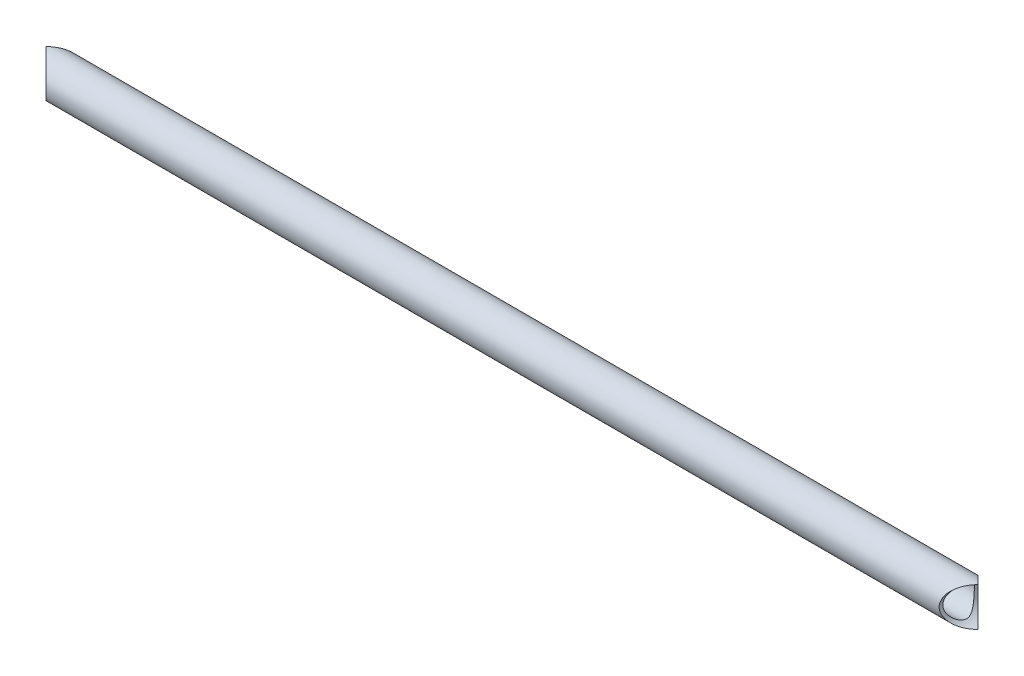
ISO-10303-21;
HEADER;
FILE_DESCRIPTION(('STEP AP214'),'2;1');
FILE_NAME('part.step','',(''),(''),'','','');
FILE_SCHEMA(('AUTOMOTIVE_DESIGN { 1 0 10303 214 1 1 1 1 }'));
ENDSEC;
DATA;
#1=APPLICATION_CONTEXT('core data for automotive mechanical design processes');
#2=APPLICATION_PROTOCOL_DEFINITION('international standard','automotive_design',2000,#1);
#3=PRODUCT_CONTEXT('',#1,'mechanical');
#4=PRODUCT('Part','Part','',(#3));
#5=PRODUCT_RELATED_PRODUCT_CATEGORY('part','',(#4));
#6=PRODUCT_DEFINITION_FORMATION('','',#4);
#7=PRODUCT_DEFINITION_CONTEXT('part definition',#1,'design');
#8=PRODUCT_DEFINITION('design','',#6,#7);
#9=PRODUCT_DEFINITION_SHAPE('','',#8);
#10=(LENGTH_UNIT() NAMED_UNIT(*) SI_UNIT(.MILLI.,.METRE.));
#11=(NAMED_UNIT(*) PLANE_ANGLE_UNIT() SI_UNIT($,.RADIAN.));
#12=(NAMED_UNIT(*) SI_UNIT($,.STERADIAN.) SOLID_ANGLE_UNIT());
#13=UNCERTAINTY_MEASURE_WITH_UNIT(LENGTH_MEASURE(1.E-05),#10,'distance_accuracy_value','');
#14=(GEOMETRIC_REPRESENTATION_CONTEXT(3) GLOBAL_UNCERTAINTY_ASSIGNED_CONTEXT((#13)) GLOBAL_UNIT_ASSIGNED_CONTEXT((#10,
#11,#12)) REPRESENTATION_CONTEXT('',''));
#15=CARTESIAN_POINT('',(0.,0.,0.));
#16=DIRECTION('',(0.,0.,1.));
#17=DIRECTION('',(1.,0.,0.));
#18=AXIS2_PLACEMENT_3D('',#15,#16,#17);
#19=CARTESIAN_POINT('',(473.575059000242,250.,-150.));
#20=DIRECTION('',(1.,0.,0.));
#21=DIRECTION('',(0.,0.,-1.));
#22=AXIS2_PLACEMENT_3D('',#19,#20,#21);
#23=CYLINDRICAL_SURFACE('',#22,7.93750000000001);
#24=CARTESIAN_POINT('',(473.575059000242,250.,-150.));
#25=DIRECTION('',(0.707106781186547,0.,-0.707106781186547));
#26=DIRECTION('',(0.707106781186547,0.,0.707106781186547));
#27=AXIS2_PLACEMENT_3D('',#24,#25,#26);
#28=ELLIPSE('',#27,11.2253201513364,7.93749999999999);
#29=CARTESIAN_POINT('',(473.575059000242,257.9375,-150.));
#30=VERTEX_POINT('',#29);
#31=CARTESIAN_POINT('',(473.575059000242,242.0625,-150.));
#32=VERTEX_POINT('',#31);
#33=EDGE_CURVE('E80',#30,#32,#28,.T.);
#34=ORIENTED_EDGE('',*,*,#33,.T.);
#35=CARTESIAN_POINT('',(473.575059000242,250.,-150.));
#36=DIRECTION('',(0.707106781186547,0.,0.707106781186547));
#37=DIRECTION('',(0.707106781186547,0.,-0.707106781186547));
#38=AXIS2_PLACEMENT_3D('',#35,#36,#37);
#39=ELLIPSE('',#38,11.2253201513364,7.93749999999999);
#40=EDGE_CURVE('E56',#32,#30,#39,.T.);
#41=ORIENTED_EDGE('',*,*,#40,.T.);
#42=EDGE_LOOP('',(#34,#41));
#43=FACE_BOUND('',#42,.T.);
#44=CARTESIAN_POINT('',(854.389836714472,250.,-150.));
#45=DIRECTION('',(0.707106781186547,0.,0.707106781186547));
#46=DIRECTION('',(0.707106781186547,0.,-0.707106781186547));
#47=AXIS2_PLACEMENT_3D('',#44,#45,#46);
#48=ELLIPSE('',#47,11.2253201513364,7.93749999999999);
#49=CARTESIAN_POINT('',(854.389836714472,242.0625,-150.));
#50=VERTEX_POINT('',#49);
#51=CARTESIAN_POINT('',(854.389836714472,257.9375,-150.));
#52=VERTEX_POINT('',#51);
#53=EDGE_CURVE('E68',#50,#52,#48,.F.);
#54=ORIENTED_EDGE('',*,*,#53,.T.);
#55=CARTESIAN_POINT('',(854.389836714472,250.,-150.));
#56=DIRECTION('',(0.707106781186547,0.,-0.707106781186547));
#57=DIRECTION('',(0.707106781186547,0.,0.707106781186547));
#58=AXIS2_PLACEMENT_3D('',#55,#56,#57);
#59=ELLIPSE('',#58,11.2253201513364,7.93749999999999);
#60=EDGE_CURVE('E73',#52,#50,#59,.F.);
#61=ORIENTED_EDGE('',*,*,#60,.T.);
#62=EDGE_LOOP('',(#54,#61));
#63=FACE_BOUND('',#62,.T.);
#64=ADVANCED_FACE('F43',(#43,#63),#23,.T.);
#65=CARTESIAN_POINT('',(854.389836714472,250.,-157.9375));
#66=DIRECTION('',(0.,0.,1.));
#67=DIRECTION('',(1.,0.,0.));
#68=AXIS2_PLACEMENT_3D('',#65,#66,#67);
#69=CYLINDRICAL_SURFACE('',#68,7.93749999999998);
#70=CARTESIAN_POINT('',(846.452336714472,250.,-156.4375));
#71=CARTESIAN_POINT('',(846.452336117175,249.845946496122,-156.437500608444));
#72=CARTESIAN_POINT('',(846.456830229221,249.691900724008,-156.431961861972));
#73=CARTESIAN_POINT('',(846.474700701227,249.385058459248,-156.409907964997));
#74=CARTESIAN_POINT('',(846.488080406953,249.232262459136,-156.393388679899));
#75=CARTESIAN_POINT('',(846.523433367951,248.929051553255,-156.349643097306));
#76=CARTESIAN_POINT('',(846.545416266588,248.778639517231,-156.322404784608));
#77=CARTESIAN_POINT('',(846.597495426092,248.481413874922,-156.257671431219));
#78=CARTESIAN_POINT('',(846.627595364868,248.334601932852,-156.220171740889));
#79=CARTESIAN_POINT('',(846.695054739684,248.046550732674,-156.135781077952));
#80=CARTESIAN_POINT('',(846.732363810036,247.905280551511,-156.088955195595));
#81=CARTESIAN_POINT('',(846.813667802221,247.627977679143,-155.986385089181));
#82=CARTESIAN_POINT('',(846.857665638709,247.491947303749,-155.930636976669));
#83=CARTESIAN_POINT('',(846.998561041187,247.092697989884,-155.75100221247));
#84=CARTESIAN_POINT('',(847.104421740357,246.83806793167,-155.614649482006));
#85=CARTESIAN_POINT('',(847.296649110361,246.432989070215,-155.362381999194));
#86=CARTESIAN_POINT('',(847.378318721496,246.275392602627,-155.254021151704));
#87=CARTESIAN_POINT('',(847.547835309607,245.972470576011,-155.025570265578));
#88=CARTESIAN_POINT('',(847.635682094035,245.827144634809,-154.905480592497));
#89=CARTESIAN_POINT('',(847.815901509588,245.548607749993,-154.65422539196));
#90=CARTESIAN_POINT('',(847.908286080737,245.415431727952,-154.523029906114));
#91=CARTESIAN_POINT('',(848.095411110484,245.161720710001,-154.250542275349));
#92=CARTESIAN_POINT('',(848.190151289638,245.041184223442,-154.109251324355));
#93=CARTESIAN_POINT('',(848.38149327293,244.810926239997,-153.814508680505));
#94=CARTESIAN_POINT('',(848.478099916573,244.701416988029,-153.660894305241));
#95=CARTESIAN_POINT('',(848.669147598739,244.495699490541,-153.343627993682));
#96=CARTESIAN_POINT('',(848.76358792488,244.39949556955,-153.179972818737));
#97=CARTESIAN_POINT('',(848.946988119906,244.221106016055,-152.842893363623));
#98=CARTESIAN_POINT('',(849.035961852143,244.138883901592,-152.669496128005));
#99=CARTESIAN_POINT('',(849.204761462203,243.989041488197,-152.312418105281));
#100=CARTESIAN_POINT('',(849.284595183679,243.921408624501,-152.128746340048));
#101=CARTESIAN_POINT('',(849.439827651853,243.794141174896,-151.725932449178));
#102=CARTESIAN_POINT('',(849.513283401976,243.736706882121,-151.50529171368));
#103=CARTESIAN_POINT('',(849.60343093173,243.66788659235,-151.165793962177));
#104=CARTESIAN_POINT('',(849.630129367316,243.647842794736,-151.051286247496));
#105=CARTESIAN_POINT('',(849.675830252699,243.613853877104,-150.819877384729));
#106=CARTESIAN_POINT('',(849.694836624946,243.599905648452,-150.702977488533));
#107=CARTESIAN_POINT('',(849.724431114293,243.57829921744,-150.466294074162));
#108=CARTESIAN_POINT('',(849.734930564402,243.570707239244,-150.346493259695));
#109=CARTESIAN_POINT('',(849.746628452573,243.562253730314,-150.106200444184));
#110=CARTESIAN_POINT('',(849.747827458794,243.561391788444,-149.985708485811));
#111=CARTESIAN_POINT('',(849.740856926651,243.566423175884,-149.745075220789));
#112=CARTESIAN_POINT('',(849.732682235175,243.572320220891,-149.62493414345));
#113=CARTESIAN_POINT('',(849.707396347862,243.590717789314,-149.386110915872));
#114=CARTESIAN_POINT('',(849.690283927915,243.603219217268,-149.267428967754));
#115=CARTESIAN_POINT('',(849.645095864901,243.63664931886,-149.016492195911));
#116=CARTESIAN_POINT('',(849.615851180716,243.658488532929,-148.884570577963));
#117=CARTESIAN_POINT('',(849.548477102424,243.709775136165,-148.624473321206));
#118=CARTESIAN_POINT('',(849.51034115642,243.739228137619,-148.496300523642));
#119=CARTESIAN_POINT('',(849.426760267409,243.805275030988,-148.24391055613));
#120=CARTESIAN_POINT('',(849.381297516467,243.841886368811,-148.119703930418));
#121=CARTESIAN_POINT('',(849.284710752249,243.92171701973,-147.875770758396));
#122=CARTESIAN_POINT('',(849.233588069839,243.964934780308,-147.756043167716));
#123=CARTESIAN_POINT('',(849.099083519325,244.081943056564,-147.45930377684));
#124=CARTESIAN_POINT('',(849.012853032199,244.15987460996,-147.285207345121));
#125=CARTESIAN_POINT('',(848.834403583464,244.329352710106,-146.946973540339));
#126=CARTESIAN_POINT('',(848.742181630023,244.4209060888,-146.782841223215));
#127=CARTESIAN_POINT('',(848.554758139937,244.617230349023,-146.464146687719));
#128=CARTESIAN_POINT('',(848.459553051636,244.722017473692,-146.309596584188));
#129=CARTESIAN_POINT('',(848.268824416687,244.944450183846,-146.010316545821));
#130=CARTESIAN_POINT('',(848.173300928949,245.062093506174,-145.865584889828));
#131=CARTESIAN_POINT('',(847.980892106524,245.314346976037,-145.581476038783));
#132=CARTESIAN_POINT('',(847.884069782061,245.449396043939,-145.442444906691));
#133=CARTESIAN_POINT('',(847.694574568538,245.733095448768,-145.175808522327));
#134=CARTESIAN_POINT('',(847.601902304611,245.8817478246,-145.048204988549));
#135=CARTESIAN_POINT('',(847.423052021173,246.192135374732,-144.805746634844));
#136=CARTESIAN_POINT('',(847.336860209571,246.353841152809,-144.690864478882));
#137=CARTESIAN_POINT('',(847.172901783939,246.69020796667,-144.474913242696));
#138=CARTESIAN_POINT('',(847.095131593489,246.864863449579,-144.373838294143));
#139=CARTESIAN_POINT('',(846.970381414778,247.175938226894,-144.213151946126));
#140=CARTESIAN_POINT('',(846.920862544258,247.309440050382,-144.149837473599));
#141=CARTESIAN_POINT('',(846.828123883391,247.582324121505,-144.031890582919));
#142=CARTESIAN_POINT('',(846.78490253826,247.721704906698,-143.977256021495));
#143=CARTESIAN_POINT('',(846.705546704803,248.005678939004,-143.877359002812));
#144=CARTESIAN_POINT('',(846.669408897112,248.150269706919,-143.832092155259));
#145=CARTESIAN_POINT('',(846.60490818532,248.443919146296,-143.751544631935));
#146=CARTESIAN_POINT('',(846.576545461402,248.592977921213,-143.716264187592));
#147=CARTESIAN_POINT('',(846.528062501365,248.89545913424,-143.656080551621));
#148=CARTESIAN_POINT('',(846.507992714356,249.04890238015,-143.631240859786));
#149=CARTESIAN_POINT('',(846.476809736582,249.358089211778,-143.592689744197));
#150=CARTESIAN_POINT('',(846.46569653795,249.513832795475,-143.578978310668));
#151=CARTESIAN_POINT('',(846.452698751369,249.82625752484,-143.562944686143));
#152=CARTESIAN_POINT('',(846.450812173613,249.982938461059,-143.560620039479));
#153=CARTESIAN_POINT('',(846.456309979651,250.29588227241,-143.567399382574));
#154=CARTESIAN_POINT('',(846.463693754049,250.452145174343,-143.576502621109));
#155=CARTESIAN_POINT('',(846.486437036525,250.748443283324,-143.604588646215));
#156=CARTESIAN_POINT('',(846.500991513167,250.888636935843,-143.622574611506));
#157=CARTESIAN_POINT('',(846.537293154282,251.166674442639,-143.667534746147));
#158=CARTESIAN_POINT('',(846.559042711397,251.304517499197,-143.694511905438));
#159=CARTESIAN_POINT('',(846.609323238679,251.576923773533,-143.757065038265));
#160=CARTESIAN_POINT('',(846.637851974912,251.711488055691,-143.792638179242));
#161=CARTESIAN_POINT('',(846.701196503383,251.976699325287,-143.871929162643));
#162=CARTESIAN_POINT('',(846.736014664127,252.107344815278,-143.915650073595));
#163=CARTESIAN_POINT('',(846.852661785326,252.504650839312,-144.062809396198));
#164=CARTESIAN_POINT('',(846.944254459611,252.763778997731,-144.179258803792));
#165=CARTESIAN_POINT('',(847.147081420435,253.258543255128,-144.441054910504));
#166=CARTESIAN_POINT('',(847.258328669965,253.494163688332,-144.586420689162));
#167=CARTESIAN_POINT('',(847.462249817372,253.878913693528,-144.858533635712));
#168=CARTESIAN_POINT('',(847.551629023476,254.034020281658,-144.979423050107));
#169=CARTESIAN_POINT('',(847.735637045691,254.330820938495,-145.233082052683));
#170=CARTESIAN_POINT('',(847.830265904415,254.472514898304,-145.365851737302));
#171=CARTESIAN_POINT('',(848.022848490047,254.742673471226,-145.642711861469));
#172=CARTESIAN_POINT('',(848.120809329027,254.871107073116,-145.786827508417));
#173=CARTESIAN_POINT('',(848.31756542057,255.114280847423,-146.085586559862));
#174=CARTESIAN_POINT('',(848.416360469619,255.229024261891,-146.240227458138));
#175=CARTESIAN_POINT('',(848.597640212908,255.428603889373,-146.536102212588));
#176=CARTESIAN_POINT('',(848.680363718147,255.515349480888,-146.675905307975));
#177=CARTESIAN_POINT('',(848.842691135115,255.678584735822,-146.963162232372));
#178=CARTESIAN_POINT('',(848.922294623768,255.755073011726,-147.110617092706));
#179=CARTESIAN_POINT('',(849.07588235154,255.897178242886,-147.413009477529));
#180=CARTESIAN_POINT('',(849.149879756937,255.962821126779,-147.567927977339));
#181=CARTESIAN_POINT('',(849.289562251927,256.082727395312,-147.885602428293));
#182=CARTESIAN_POINT('',(849.355252157132,256.136997384581,-148.048353762729));
#183=CARTESIAN_POINT('',(849.491771838547,256.246805805974,-148.428952494324));
#184=CARTESIAN_POINT('',(849.558835273736,256.298393656731,-148.64940369867));
#185=CARTESIAN_POINT('',(849.638515491533,256.358455473828,-148.987781714222));
#186=CARTESIAN_POINT('',(849.661582378451,256.375584472045,-149.101789236113));
#187=CARTESIAN_POINT('',(849.699836308458,256.403777899731,-149.331838396908));
#188=CARTESIAN_POINT('',(849.715027235875,256.41484531885,-149.44787900387));
#189=CARTESIAN_POINT('',(849.736902843023,256.430730926076,-149.682180246307));
#190=CARTESIAN_POINT('',(849.743515086158,256.43549590418,-149.800451339474));
#191=CARTESIAN_POINT('',(849.747652214957,256.438480907242,-150.037233968951));
#192=CARTESIAN_POINT('',(849.745177437482,256.436701174815,-150.155745496185));
#193=CARTESIAN_POINT('',(849.731267040817,256.426640385183,-150.392039973069));
#194=CARTESIAN_POINT('',(849.719825070421,256.418354720003,-150.509822346663));
#195=CARTESIAN_POINT('',(849.688546811481,256.395478911536,-150.743689789429));
#196=CARTESIAN_POINT('',(849.668705935939,256.380885323132,-150.859773895209));
#197=CARTESIAN_POINT('',(849.616930996133,256.342279706912,-151.111826220293));
#198=CARTESIAN_POINT('',(849.583395004987,256.316987540786,-151.247268171872));
#199=CARTESIAN_POINT('',(849.507409471479,256.258442607806,-151.513923892147));
#200=CARTESIAN_POINT('',(849.464952906018,256.225183565785,-151.645134234883));
#201=CARTESIAN_POINT('',(849.372855463585,256.151202988486,-151.903200724185));
#202=CARTESIAN_POINT('',(849.32319717628,256.110463303175,-152.030045369799));
#203=CARTESIAN_POINT('',(849.218452764175,256.022075592558,-152.278913314768));
#204=CARTESIAN_POINT('',(849.163368058877,255.974429372412,-152.40093786338));
#205=CARTESIAN_POINT('',(849.019928485145,255.846481612763,-152.701624714565));
#206=CARTESIAN_POINT('',(848.92898959641,255.761957820115,-152.877267498439));
#207=CARTESIAN_POINT('',(848.741949588296,255.578749766454,-153.218138678328));
#208=CARTESIAN_POINT('',(848.645846035772,255.480058793839,-153.383362084535));
#209=CARTESIAN_POINT('',(848.451504874175,255.268846527102,-153.703714846521));
#210=CARTESIAN_POINT('',(848.353264967858,255.156309670554,-153.858832538752));
#211=CARTESIAN_POINT('',(848.157355839532,254.917714985548,-154.158626674223));
#212=CARTESIAN_POINT('',(848.059686521188,254.791659513416,-154.303304929752));
#213=CARTESIAN_POINT('',(847.864770166768,254.522793998787,-154.585260944364));
#214=CARTESIAN_POINT('',(847.767593715729,254.379645888571,-154.722266072264));
#215=CARTESIAN_POINT('',(847.578459788172,254.079283163769,-154.984027982882));
#216=CARTESIAN_POINT('',(847.48650318347,253.92206621064,-155.108782722065));
#217=CARTESIAN_POINT('',(847.310278519823,253.594207077864,-155.344506764618));
#218=CARTESIAN_POINT('',(847.225993566814,253.423596018183,-155.455506563381));
#219=CARTESIAN_POINT('',(847.067177846831,253.069237293137,-155.662440218374));
#220=CARTESIAN_POINT('',(846.992641859928,252.885496739924,-155.758382142652));
#221=CARTESIAN_POINT('',(846.876630095035,252.564216129209,-155.906537825633));
#222=CARTESIAN_POINT('',(846.832029085518,252.42980626639,-155.963134524704));
#223=CARTESIAN_POINT('',(846.749333496696,252.155711415806,-156.067603299422));
#224=CARTESIAN_POINT('',(846.711237244745,252.016027795461,-156.11547761817));
#225=CARTESIAN_POINT('',(846.642303981088,251.732314548625,-156.201809207691));
#226=CARTESIAN_POINT('',(846.611453915345,251.588293273019,-156.240283417905));
#227=CARTESIAN_POINT('',(846.557546359713,251.296582579713,-156.307350475281));
#228=CARTESIAN_POINT('',(846.534486247306,251.148894414496,-156.335946647994));
#229=CARTESIAN_POINT('',(846.494687351236,250.835448680774,-156.385226542622));
#230=CARTESIAN_POINT('',(846.478845498381,250.669398115866,-156.404790422698));
#231=CARTESIAN_POINT('',(846.457669166133,250.335562264581,-156.430928475545));
#232=CARTESIAN_POINT('',(846.452337364977,250.167776546989,-156.437499337356));
#233=CARTESIAN_POINT('',(846.452336714472,250.,-156.4375));
#234=B_SPLINE_CURVE_WITH_KNOTS('',3,(#70,#71,#72,#73,#74,#75,#76,#77,#78,#79,#80,#81,#82,#83,
#84,#85,#86,#87,#88,#89,#90,#91,#92,#93,#94,#95,#96,#97,#98,#99,#100,#101,#102,#103,#104,#105,
#106,#107,#108,#109,#110,#111,#112,#113,#114,#115,#116,#117,#118,#119,#120,#121,#122,#123,#124,
#125,#126,#127,#128,#129,#130,#131,#132,#133,#134,#135,#136,#137,#138,#139,#140,#141,#142,#143,
#144,#145,#146,#147,#148,#149,#150,#151,#152,#153,#154,#155,#156,#157,#158,#159,#160,#161,#162,
#163,#164,#165,#166,#167,#168,#169,#170,#171,#172,#173,#174,#175,#176,#177,#178,#179,#180,#181,
#182,#183,#184,#185,#186,#187,#188,#189,#190,#191,#192,#193,#194,#195,#196,#197,#198,#199,#200,
#201,#202,#203,#204,#205,#206,#207,#208,#209,#210,#211,#212,#213,#214,#215,#216,#217,#218,#219,
#220,#221,#222,#223,#224,#225,#226,#227,#228,#229,#230,#231,#232,#233),.UNSPECIFIED.,.T.,.F.,(4,
2,2,2,2,2,2,2,2,2,2,2,2,2,2,2,2,2,2,2,2,2,2,2,2,2,2,2,2,2,2,2,2,2,2,2,2,2,2,2,2,2,2,2,2,2,2,2,2,
2,2,2,2,2,2,2,2,2,2,2,2,2,2,2,2,2,2,2,2,2,2,2,2,2,2,2,2,2,2,2,2,4),(0.,0.461983804893548,
0.924141663037827,1.38681904691494,1.84970642754538,2.3094697619533,2.76943401716177,
3.68855815609817,4.31176065043688,4.93494372754673,5.55986497915289,6.18471244733905,
6.81991133646268,7.4553161966253,8.08903680654518,8.72220943601936,9.43812738361899,
9.79559921838156,10.1528885354109,10.5138556034542,10.8748006199653,11.2359441581723,
11.5971371715184,12.0071413632326,12.4174486439693,12.8287686563466,13.2399921562756,
13.8670458475504,14.4944151006166,15.1225620117489,15.7505985237147,16.3998516717728,
17.0492022917975,17.6971293237192,18.3447801116176,18.8118456346532,19.2787956485431,
19.7455263224611,20.2122678116676,20.6818082883573,21.151348352633,21.6207871517084,
22.0901950933264,22.5159769206623,22.9419004793909,23.3676838781711,23.7936279563194,
24.6854741328246,25.5779107290334,26.2251517033765,26.8723979322333,27.5211250939669,
28.1696983207223,28.7217289303698,29.2738341384588,29.8245996772346,30.3750444757332,
31.0805742266783,31.4329286227948,31.7851090762433,32.1402443178906,32.4953663946207,
32.8507402217215,33.2063083844893,33.6310660160364,34.0561593174991,34.4822979741033,
34.9083254510946,35.5526662184167,36.1973132512347,36.8426915862972,37.487957612627,
38.1492313691108,38.8106152483941,39.4705055253033,40.1300410153284,40.5871349208618,
41.044111110794,41.5002576314256,41.9562504351793,42.4592594650595,42.9623966582976),.UNSPECIFIED.);
#235=CARTESIAN_POINT('',(846.452336714472,250.,-156.4375));
#236=VERTEX_POINT('',#235);
#237=EDGE_CURVE('E77',#236,#236,#234,.T.);
#238=ORIENTED_EDGE('',*,*,#237,.T.);
#239=EDGE_LOOP('',(#238));
#240=FACE_BOUND('',#239,.T.);
#241=ORIENTED_EDGE('',*,*,#60,.F.);
#242=ORIENTED_EDGE('',*,*,#53,.F.);
#243=EDGE_LOOP('',(#241,#242));
#244=FACE_BOUND('',#243,.T.);
#245=ADVANCED_FACE('F74',(#240,#244),#69,.F.);
#246=CARTESIAN_POINT('',(473.575059000242,250.,-157.9375));
#247=DIRECTION('',(0.,0.,1.));
#248=DIRECTION('',(1.,0.,0.));
#249=AXIS2_PLACEMENT_3D('',#246,#247,#248);
#250=CYLINDRICAL_SURFACE('',#249,7.93749999999998);
#251=CARTESIAN_POINT('',(481.512559000242,250.,-156.4375));
#252=CARTESIAN_POINT('',(481.512559597539,250.154053503878,-156.437500608444));
#253=CARTESIAN_POINT('',(481.508065485493,250.308099275992,-156.431961861972));
#254=CARTESIAN_POINT('',(481.490195013487,250.614941540752,-156.409907964997));
#255=CARTESIAN_POINT('',(481.476815307761,250.767737540864,-156.393388679899));
#256=CARTESIAN_POINT('',(481.441462346763,251.070948446745,-156.349643097306));
#257=CARTESIAN_POINT('',(481.419479448126,251.221360482769,-156.322404784608));
#258=CARTESIAN_POINT('',(481.367400288622,251.518586125078,-156.257671431219));
#259=CARTESIAN_POINT('',(481.337300349846,251.665398067148,-156.220171740889));
#260=CARTESIAN_POINT('',(481.26984097503,251.953449267325,-156.135781077952));
#261=CARTESIAN_POINT('',(481.232531904678,252.094719448489,-156.088955195595));
#262=CARTESIAN_POINT('',(481.151227912492,252.372022320857,-155.986385089181));
#263=CARTESIAN_POINT('',(481.107230076005,252.508052696251,-155.930636976669));
#264=CARTESIAN_POINT('',(480.966334673527,252.907302010116,-155.75100221247));
#265=CARTESIAN_POINT('',(480.860473974357,253.16193206833,-155.614649482006));
#266=CARTESIAN_POINT('',(480.668246604353,253.567010929785,-155.362381999194));
#267=CARTESIAN_POINT('',(480.586576993218,253.724607397373,-155.254021151704));
#268=CARTESIAN_POINT('',(480.417060405107,254.027529423989,-155.025570265578));
#269=CARTESIAN_POINT('',(480.329213620679,254.172855365191,-154.905480592497));
#270=CARTESIAN_POINT('',(480.148994205126,254.451392250007,-154.65422539196));
#271=CARTESIAN_POINT('',(480.056609633977,254.584568272048,-154.523029906114));
#272=CARTESIAN_POINT('',(479.86948460423,254.838279289999,-154.250542275349));
#273=CARTESIAN_POINT('',(479.774744425076,254.958815776558,-154.109251324355));
#274=CARTESIAN_POINT('',(479.583402441784,255.189073760003,-153.814508680505));
#275=CARTESIAN_POINT('',(479.486795798141,255.298583011971,-153.660894305241));
#276=CARTESIAN_POINT('',(479.295748115975,255.504300509459,-153.343627993682));
#277=CARTESIAN_POINT('',(479.201307789834,255.60050443045,-153.179972818737));
#278=CARTESIAN_POINT('',(479.017907594808,255.778893983945,-152.842893363623));
#279=CARTESIAN_POINT('',(478.928933862571,255.861116098408,-152.669496128005));
#280=CARTESIAN_POINT('',(478.760134252511,256.010958511803,-152.312418105281));
#281=CARTESIAN_POINT('',(478.680300531035,256.078591375499,-152.128746340048));
#282=CARTESIAN_POINT('',(478.525068062861,256.205858825104,-151.725932449178));
#283=CARTESIAN_POINT('',(478.451612312738,256.263293117879,-151.50529171368));
#284=CARTESIAN_POINT('',(478.361464782984,256.33211340765,-151.165793962177));
#285=CARTESIAN_POINT('',(478.334766347398,256.352157205264,-151.051286247496));
#286=CARTESIAN_POINT('',(478.289065462015,256.386146122896,-150.819877384729));
#287=CARTESIAN_POINT('',(478.270059089767,256.400094351548,-150.702977488533));
#288=CARTESIAN_POINT('',(478.240464600421,256.42170078256,-150.466294074162));
#289=CARTESIAN_POINT('',(478.229965150311,256.429292760756,-150.346493259695));
#290=CARTESIAN_POINT('',(478.218267262142,256.437746269686,-150.106200444184));
#291=CARTESIAN_POINT('',(478.21706825592,256.438608211556,-149.985708485811));
#292=CARTESIAN_POINT('',(478.224038788063,256.433576824116,-149.74507522079));
#293=CARTESIAN_POINT('',(478.232213479539,256.427679779109,-149.624934143451));
#294=CARTESIAN_POINT('',(478.257499366852,256.409282210686,-149.386110915872));
#295=CARTESIAN_POINT('',(478.274611786799,256.396780782732,-149.267428967754));
#296=CARTESIAN_POINT('',(478.319799849813,256.36335068114,-149.016492195911));
#297=CARTESIAN_POINT('',(478.349044533998,256.341511467071,-148.884570577963));
#298=CARTESIAN_POINT('',(478.41641861229,256.290224863835,-148.624473321206));
#299=CARTESIAN_POINT('',(478.454554558294,256.260771862381,-148.496300523643));
#300=CARTESIAN_POINT('',(478.538135447305,256.194724969012,-148.243910556131));
#301=CARTESIAN_POINT('',(478.583598198247,256.158113631189,-148.119703930418));
#302=CARTESIAN_POINT('',(478.680184962465,256.07828298027,-147.875770758396));
#303=CARTESIAN_POINT('',(478.731307644875,256.035065219692,-147.756043167717));
#304=CARTESIAN_POINT('',(478.865812195389,255.918056943437,-147.45930377684));
#305=CARTESIAN_POINT('',(478.952042682515,255.84012539004,-147.285207345121));
#306=CARTESIAN_POINT('',(479.13049213125,255.670647289894,-146.946973540339));
#307=CARTESIAN_POINT('',(479.222714084691,255.579093911201,-146.782841223216));
#308=CARTESIAN_POINT('',(479.410137574777,255.382769650977,-146.464146687719));
#309=CARTESIAN_POINT('',(479.505342663077,255.277982526309,-146.309596584188));
#310=CARTESIAN_POINT('',(479.696071298027,255.055549816154,-146.010316545821));
#311=CARTESIAN_POINT('',(479.791594785765,254.937906493827,-145.865584889828));
#312=CARTESIAN_POINT('',(479.984003608189,254.685653023963,-145.581476038784));
#313=CARTESIAN_POINT('',(480.080825932652,254.550603956061,-145.442444906691));
#314=CARTESIAN_POINT('',(480.270321146176,254.266904551233,-145.175808522328));
#315=CARTESIAN_POINT('',(480.362993410103,254.1182521754,-145.04820498855));
#316=CARTESIAN_POINT('',(480.541843693541,253.807864625268,-144.805746634844));
#317=CARTESIAN_POINT('',(480.628035505143,253.646158847191,-144.690864478882));
#318=CARTESIAN_POINT('',(480.791993930774,253.30979203333,-144.474913242696));
#319=CARTESIAN_POINT('',(480.869764121225,253.135136550421,-144.373838294143));
#320=CARTESIAN_POINT('',(480.994514299936,252.824061773107,-144.213151946126));
#321=CARTESIAN_POINT('',(481.044033170456,252.690559949619,-144.149837473599));
#322=CARTESIAN_POINT('',(481.136771831323,252.417675878495,-144.031890582919));
#323=CARTESIAN_POINT('',(481.179993176454,252.278295093303,-143.977256021495));
#324=CARTESIAN_POINT('',(481.259349009911,251.994321060996,-143.877359002812));
#325=CARTESIAN_POINT('',(481.295486817602,251.849730293081,-143.832092155259));
#326=CARTESIAN_POINT('',(481.359987529394,251.556080853704,-143.751544631935));
#327=CARTESIAN_POINT('',(481.388350253312,251.407022078788,-143.716264187592));
#328=CARTESIAN_POINT('',(481.436833213349,251.104540865761,-143.656080551621));
#329=CARTESIAN_POINT('',(481.456903000358,250.95109761985,-143.631240859786));
#330=CARTESIAN_POINT('',(481.488085978132,250.641910788222,-143.592689744197));
#331=CARTESIAN_POINT('',(481.499199176764,250.486167204525,-143.578978310668));
#332=CARTESIAN_POINT('',(481.512196963345,250.173742475161,-143.562944686143));
#333=CARTESIAN_POINT('',(481.514083541101,250.017061538941,-143.560620039479));
#334=CARTESIAN_POINT('',(481.508585735062,249.704117727591,-143.567399382574));
#335=CARTESIAN_POINT('',(481.501201960665,249.547854825657,-143.576502621109));
#336=CARTESIAN_POINT('',(481.478458678189,249.251556716677,-143.604588646215));
#337=CARTESIAN_POINT('',(481.463904201547,249.111363064157,-143.622574611505));
#338=CARTESIAN_POINT('',(481.427602560432,248.833325557361,-143.667534746147));
#339=CARTESIAN_POINT('',(481.405853003318,248.695482500803,-143.694511905438));
#340=CARTESIAN_POINT('',(481.355572476035,248.423076226467,-143.757065038265));
#341=CARTESIAN_POINT('',(481.327043739802,248.288511944309,-143.792638179242));
#342=CARTESIAN_POINT('',(481.263699211331,248.023300674713,-143.871929162642));
#343=CARTESIAN_POINT('',(481.228881050587,247.892655184723,-143.915650073595));
#344=CARTESIAN_POINT('',(481.112233929388,247.495349160689,-144.062809396198));
#345=CARTESIAN_POINT('',(481.020641255103,247.236221002269,-144.179258803792));
#346=CARTESIAN_POINT('',(480.81781429428,246.741456744872,-144.441054910504));
#347=CARTESIAN_POINT('',(480.706567044749,246.505836311668,-144.586420689162));
#348=CARTESIAN_POINT('',(480.502645897342,246.121086306473,-144.858533635711));
#349=CARTESIAN_POINT('',(480.413266691239,245.965979718342,-144.979423050107));
#350=CARTESIAN_POINT('',(480.229258669023,245.669179061505,-145.233082052683));
#351=CARTESIAN_POINT('',(480.1346298103,245.527485101696,-145.365851737302));
#352=CARTESIAN_POINT('',(479.942047224667,245.257326528774,-145.642711861469));
#353=CARTESIAN_POINT('',(479.844086385687,245.128892926884,-145.786827508416));
#354=CARTESIAN_POINT('',(479.647330294145,244.885719152578,-146.085586559862));
#355=CARTESIAN_POINT('',(479.548535245095,244.77097573811,-146.240227458138));
#356=CARTESIAN_POINT('',(479.367255501807,244.571396110627,-146.536102212587));
#357=CARTESIAN_POINT('',(479.284531996568,244.484650519112,-146.675905307975));
#358=CARTESIAN_POINT('',(479.1222045796,244.321415264178,-146.963162232371));
#359=CARTESIAN_POINT('',(479.042601090946,244.244926988274,-147.110617092706));
#360=CARTESIAN_POINT('',(478.889013363175,244.102821757114,-147.413009477528));
#361=CARTESIAN_POINT('',(478.815015957778,244.037178873221,-147.567927977339));
#362=CARTESIAN_POINT('',(478.675333462787,243.917272604688,-147.885602428293));
#363=CARTESIAN_POINT('',(478.609643557582,243.86300261542,-148.048353762729));
#364=CARTESIAN_POINT('',(478.473123876167,243.753194194026,-148.428952494324));
#365=CARTESIAN_POINT('',(478.406060440978,243.701606343269,-148.64940369867));
#366=CARTESIAN_POINT('',(478.326380223181,243.641544526172,-148.987781714222));
#367=CARTESIAN_POINT('',(478.303313336263,243.624415527955,-149.101789236112));
#368=CARTESIAN_POINT('',(478.265059406256,243.596222100269,-149.331838396907));
#369=CARTESIAN_POINT('',(478.249868478839,243.58515468115,-149.44787900387));
#370=CARTESIAN_POINT('',(478.227992871691,243.569269073924,-149.682180246307));
#371=CARTESIAN_POINT('',(478.221380628556,243.56450409582,-149.800451339474));
#372=CARTESIAN_POINT('',(478.217243499757,243.561519092758,-150.037233968951));
#373=CARTESIAN_POINT('',(478.219718277232,243.563298825185,-150.155745496185));
#374=CARTESIAN_POINT('',(478.233628673897,243.573359614817,-150.392039973069));
#375=CARTESIAN_POINT('',(478.245070644293,243.581645279997,-150.509822346663));
#376=CARTESIAN_POINT('',(478.276348903233,243.604521088464,-150.743689789428));
#377=CARTESIAN_POINT('',(478.296189778775,243.619114676868,-150.859773895209));
#378=CARTESIAN_POINT('',(478.347964718581,243.657720293088,-151.111826220293));
#379=CARTESIAN_POINT('',(478.381500709727,243.683012459214,-151.247268171872));
#380=CARTESIAN_POINT('',(478.457486243235,243.741557392194,-151.513923892147));
#381=CARTESIAN_POINT('',(478.499942808696,243.774816434215,-151.645134234883));
#382=CARTESIAN_POINT('',(478.592040251129,243.848797011514,-151.903200724185));
#383=CARTESIAN_POINT('',(478.641698538434,243.889536696825,-152.030045369799));
#384=CARTESIAN_POINT('',(478.746442950539,243.977924407442,-152.278913314768));
#385=CARTESIAN_POINT('',(478.801527655836,244.025570627588,-152.40093786338));
#386=CARTESIAN_POINT('',(478.944967229569,244.153518387237,-152.701624714564));
#387=CARTESIAN_POINT('',(479.035906118304,244.238042179885,-152.877267498439));
#388=CARTESIAN_POINT('',(479.222946126418,244.421250233546,-153.218138678327));
#389=CARTESIAN_POINT('',(479.319049678942,244.51994120616,-153.383362084534));
#390=CARTESIAN_POINT('',(479.513390840538,244.731153472898,-153.703714846521));
#391=CARTESIAN_POINT('',(479.611630746855,244.843690329446,-153.858832538752));
#392=CARTESIAN_POINT('',(479.807539875181,245.082285014452,-154.158626674223));
#393=CARTESIAN_POINT('',(479.905209193526,245.208340486584,-154.303304929751));
#394=CARTESIAN_POINT('',(480.100125547946,245.477206001213,-154.585260944363));
#395=CARTESIAN_POINT('',(480.197301998985,245.620354111429,-154.722266072264));
#396=CARTESIAN_POINT('',(480.386435926542,245.92071683623,-154.984027982881));
#397=CARTESIAN_POINT('',(480.478392531244,246.077933789359,-155.108782722065));
#398=CARTESIAN_POINT('',(480.654617194891,246.405792922135,-155.344506764618));
#399=CARTESIAN_POINT('',(480.7389021479,246.576403981817,-155.45550656338));
#400=CARTESIAN_POINT('',(480.897717867883,246.930762706863,-155.662440218374));
#401=CARTESIAN_POINT('',(480.972253854785,247.114503260076,-155.758382142652));
#402=CARTESIAN_POINT('',(481.088265619679,247.435783870791,-155.906537825633));
#403=CARTESIAN_POINT('',(481.132866629196,247.57019373361,-155.963134524704));
#404=CARTESIAN_POINT('',(481.215562218018,247.844288584193,-156.067603299422));
#405=CARTESIAN_POINT('',(481.253658469969,247.983972204538,-156.11547761817));
#406=CARTESIAN_POINT('',(481.322591733626,248.267685451375,-156.201809207691));
#407=CARTESIAN_POINT('',(481.353441799369,248.411706726981,-156.240283417905));
#408=CARTESIAN_POINT('',(481.407349355001,248.703417420287,-156.307350475281));
#409=CARTESIAN_POINT('',(481.430409467408,248.851105585504,-156.335946647994));
#410=CARTESIAN_POINT('',(481.470208363478,249.164551319225,-156.385226542622));
#411=CARTESIAN_POINT('',(481.486050216332,249.330601884134,-156.404790422698));
#412=CARTESIAN_POINT('',(481.507226548581,249.664437735419,-156.430928475545));
#413=CARTESIAN_POINT('',(481.512558349738,249.832223453011,-156.437499337356));
#414=CARTESIAN_POINT('',(481.512559000242,250.,-156.4375));
#415=B_SPLINE_CURVE_WITH_KNOTS('',3,(#251,#252,#253,#254,#255,#256,#257,#258,#259,#260,#261,
#262,#263,#264,#265,#266,#267,#268,#269,#270,#271,#272,#273,#274,#275,#276,#277,#278,#279,#280,
#281,#282,#283,#284,#285,#286,#287,#288,#289,#290,#291,#292,#293,#294,#295,#296,#297,#298,#299,
#300,#301,#302,#303,#304,#305,#306,#307,#308,#309,#310,#311,#312,#313,#314,#315,#316,#317,#318,
#319,#320,#321,#322,#323,#324,#325,#326,#327,#328,#329,#330,#331,#332,#333,#334,#335,#336,#337,
#338,#339,#340,#341,#342,#343,#344,#345,#346,#347,#348,#349,#350,#351,#352,#353,#354,#355,#356,
#357,#358,#359,#360,#361,#362,#363,#364,#365,#366,#367,#368,#369,#370,#371,#372,#373,#374,#375,
#376,#377,#378,#379,#380,#381,#382,#383,#384,#385,#386,#387,#388,#389,#390,#391,#392,#393,#394,
#395,#396,#397,#398,#399,#400,#401,#402,#403,#404,#405,#406,#407,#408,#409,#410,#411,#412,#413,
#414),.UNSPECIFIED.,.T.,.F.,(4,2,2,2,2,2,2,2,2,2,2,2,2,2,2,2,2,2,2,2,2,2,2,2,2,2,2,2,2,2,2,2,2,
2,2,2,2,2,2,2,2,2,2,2,2,2,2,2,2,2,2,2,2,2,2,2,2,2,2,2,2,2,2,2,2,2,2,2,2,2,2,2,2,2,2,2,2,2,2,2,2,
4),(0.,0.461983804893523,0.924141663037798,1.38681904691487,1.84970642754534,2.3094697619533,
2.76943401716175,3.68855815609816,4.31176065043686,4.93494372754669,5.5598649791528,
6.18471244733901,6.81991133646268,7.45531619662531,8.08903680654509,8.72220943601931,
9.43812738361897,9.79559921838149,10.1528885354108,10.5138556034541,10.8748006199652,
11.2359441581722,11.5971371715182,12.0071413632325,12.4174486439691,12.8287686563464,
13.2399921562754,13.8670458475502,14.4944151006162,15.1225620117485,15.7505985237143,
16.3998516717723,17.0492022917971,17.6971293237189,18.3447801116171,18.8118456346528,
19.2787956485426,19.7455263224606,20.2122678116672,20.681808288357,21.1513483526326,
21.6207871517079,22.090195093326,22.5159769206619,22.9419004793906,23.3676838781709,
23.793627956319,24.6854741328242,25.577910729033,26.225151703376,26.8723979322328,
27.5211250939665,28.1696983207218,28.7217289303694,29.2738341384585,29.8245996772342,
30.3750444757329,31.0805742266781,31.4329286227945,31.785109076243,32.1402443178903,
32.4953663946204,32.8507402217213,33.206308384489,33.6310660160361,34.0561593174988,
34.482297974103,34.9083254510942,35.5526662184161,36.1973132512343,36.8426915862967,
37.4879576126266,38.1492313691104,38.8106152483937,39.4705055253029,40.1300410153279,
40.5871349208614,41.0441111107936,41.5002576314253,41.9562504351789,42.4592594650593,
42.9623966582976),.UNSPECIFIED.);
#416=CARTESIAN_POINT('',(481.512559000242,250.,-156.4375));
#417=VERTEX_POINT('',#416);
#418=EDGE_CURVE('E12',#417,#417,#415,.T.);
#419=ORIENTED_EDGE('',*,*,#418,.T.);
#420=EDGE_LOOP('',(#419));
#421=FACE_BOUND('',#420,.T.);
#422=ORIENTED_EDGE('',*,*,#33,.F.);
#423=ORIENTED_EDGE('',*,*,#40,.F.);
#424=EDGE_LOOP('',(#422,#423));
#425=FACE_BOUND('',#424,.T.);
#426=ADVANCED_FACE('F89',(#421,#425),#250,.F.);
#427=CARTESIAN_POINT('',(473.575059000242,250.,-150.));
#428=DIRECTION('',(1.,0.,0.));
#429=DIRECTION('',(0.,0.,-1.));
#430=AXIS2_PLACEMENT_3D('',#427,#428,#429);
#431=CYLINDRICAL_SURFACE('',#430,6.43750000000001);
#432=ORIENTED_EDGE('',*,*,#418,.F.);
#433=EDGE_LOOP('',(#432));
#434=FACE_BOUND('',#433,.T.);
#435=ORIENTED_EDGE('',*,*,#237,.F.);
#436=EDGE_LOOP('',(#435));
#437=FACE_BOUND('',#436,.T.);
#438=ADVANCED_FACE('F45',(#434,#437),#431,.F.);
#439=CLOSED_SHELL('',(#64,#245,#426,#438));
#440=MANIFOLD_SOLID_BREP('B2',#439);
#441=ADVANCED_BREP_SHAPE_REPRESENTATION('',(#18,#440),#14);
#442=SHAPE_DEFINITION_REPRESENTATION(#9,#441);
ENDSEC;
END-ISO-10303-21;
